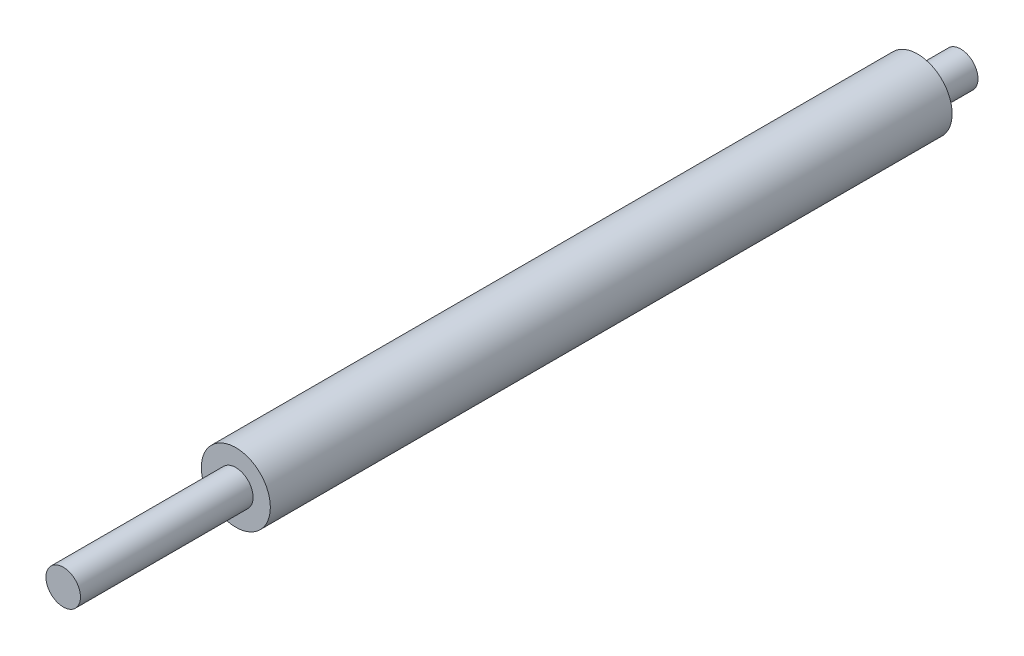
ISO-10303-21;
HEADER;
FILE_DESCRIPTION(('STEP AP214'),'2;1');
FILE_NAME('part.step','',(''),(''),'','','');
FILE_SCHEMA(('AUTOMOTIVE_DESIGN { 1 0 10303 214 1 1 1 1 }'));
ENDSEC;
DATA;
#1=APPLICATION_CONTEXT('core data for automotive mechanical design processes');
#2=APPLICATION_PROTOCOL_DEFINITION('international standard','automotive_design',2000,#1);
#3=PRODUCT_CONTEXT('',#1,'mechanical');
#4=PRODUCT('Part','Part','',(#3));
#5=PRODUCT_RELATED_PRODUCT_CATEGORY('part','',(#4));
#6=PRODUCT_DEFINITION_FORMATION('','',#4);
#7=PRODUCT_DEFINITION_CONTEXT('part definition',#1,'design');
#8=PRODUCT_DEFINITION('design','',#6,#7);
#9=PRODUCT_DEFINITION_SHAPE('','',#8);
#10=(LENGTH_UNIT() NAMED_UNIT(*) SI_UNIT(.MILLI.,.METRE.));
#11=(NAMED_UNIT(*) PLANE_ANGLE_UNIT() SI_UNIT($,.RADIAN.));
#12=(NAMED_UNIT(*) SI_UNIT($,.STERADIAN.) SOLID_ANGLE_UNIT());
#13=UNCERTAINTY_MEASURE_WITH_UNIT(LENGTH_MEASURE(1.E-05),#10,'distance_accuracy_value','');
#14=(GEOMETRIC_REPRESENTATION_CONTEXT(3) GLOBAL_UNCERTAINTY_ASSIGNED_CONTEXT((#13)) GLOBAL_UNIT_ASSIGNED_CONTEXT((#10,
#11,#12)) REPRESENTATION_CONTEXT('',''));
#15=CARTESIAN_POINT('',(0.,0.,0.));
#16=DIRECTION('',(0.,0.,1.));
#17=DIRECTION('',(1.,0.,0.));
#18=AXIS2_PLACEMENT_3D('',#15,#16,#17);
#19=CARTESIAN_POINT('',(0.,0.,59.25));
#20=DIRECTION('',(0.,0.,1.));
#21=DIRECTION('',(1.,0.,0.));
#22=AXIS2_PLACEMENT_3D('',#19,#20,#21);
#23=PLANE('',#22);
#24=CARTESIAN_POINT('',(0.,0.,59.25));
#25=DIRECTION('',(0.,0.,1.));
#26=DIRECTION('',(1.,0.,0.));
#27=AXIS2_PLACEMENT_3D('',#24,#25,#26);
#28=CIRCLE('',#27,6.);
#29=CARTESIAN_POINT('',(6.,0.,59.25));
#30=VERTEX_POINT('',#29);
#31=EDGE_CURVE('E38',#30,#30,#28,.T.);
#32=ORIENTED_EDGE('',*,*,#31,.T.);
#33=EDGE_LOOP('',(#32));
#34=FACE_BOUND('',#33,.T.);
#35=CARTESIAN_POINT('',(0.,0.,59.25));
#36=DIRECTION('',(0.,0.,1.));
#37=DIRECTION('',(1.,0.,0.));
#38=AXIS2_PLACEMENT_3D('',#35,#36,#37);
#39=CIRCLE('',#38,3.);
#40=CARTESIAN_POINT('',(3.,0.,59.25));
#41=VERTEX_POINT('',#40);
#42=EDGE_CURVE('E52',#41,#41,#39,.T.);
#43=ORIENTED_EDGE('',*,*,#42,.F.);
#44=EDGE_LOOP('',(#43));
#45=FACE_BOUND('',#44,.T.);
#46=ADVANCED_FACE('F31',(#34,#45),#23,.T.);
#47=CARTESIAN_POINT('',(0.,0.,-59.25));
#48=DIRECTION('',(0.,0.,1.));
#49=DIRECTION('',(1.,0.,0.));
#50=AXIS2_PLACEMENT_3D('',#47,#48,#49);
#51=PLANE('',#50);
#52=CARTESIAN_POINT('',(0.,0.,-59.25));
#53=DIRECTION('',(0.,0.,1.));
#54=DIRECTION('',(1.,0.,0.));
#55=AXIS2_PLACEMENT_3D('',#52,#53,#54);
#56=CIRCLE('',#55,6.);
#57=CARTESIAN_POINT('',(6.,0.,-59.25));
#58=VERTEX_POINT('',#57);
#59=EDGE_CURVE('E42',#58,#58,#56,.T.);
#60=ORIENTED_EDGE('',*,*,#59,.F.);
#61=EDGE_LOOP('',(#60));
#62=FACE_BOUND('',#61,.T.);
#63=CARTESIAN_POINT('',(0.,0.,-59.25));
#64=DIRECTION('',(0.,0.,1.));
#65=DIRECTION('',(1.,0.,0.));
#66=AXIS2_PLACEMENT_3D('',#63,#64,#65);
#67=CIRCLE('',#66,3.);
#68=CARTESIAN_POINT('',(3.,0.,-59.25));
#69=VERTEX_POINT('',#68);
#70=EDGE_CURVE('E10',#69,#69,#67,.F.);
#71=ORIENTED_EDGE('',*,*,#70,.F.);
#72=EDGE_LOOP('',(#71));
#73=FACE_BOUND('',#72,.T.);
#74=ADVANCED_FACE('F68',(#62,#73),#51,.F.);
#75=CARTESIAN_POINT('',(0.,0.,59.25));
#76=DIRECTION('',(0.,0.,-1.));
#77=DIRECTION('',(-1.,0.,0.));
#78=AXIS2_PLACEMENT_3D('',#75,#76,#77);
#79=CYLINDRICAL_SURFACE('',#78,6.);
#80=ORIENTED_EDGE('',*,*,#31,.F.);
#81=EDGE_LOOP('',(#80));
#82=FACE_BOUND('',#81,.T.);
#83=ORIENTED_EDGE('',*,*,#59,.T.);
#84=EDGE_LOOP('',(#83));
#85=FACE_BOUND('',#84,.T.);
#86=ADVANCED_FACE('F33',(#82,#85),#79,.T.);
#87=CARTESIAN_POINT('',(0.,0.,-66.75));
#88=DIRECTION('',(0.,0.,1.));
#89=DIRECTION('',(1.,0.,0.));
#90=AXIS2_PLACEMENT_3D('',#87,#88,#89);
#91=CYLINDRICAL_SURFACE('',#90,3.);
#92=CARTESIAN_POINT('',(0.,0.,-66.75));
#93=DIRECTION('',(0.,0.,-1.));
#94=DIRECTION('',(-1.,0.,0.));
#95=AXIS2_PLACEMENT_3D('',#92,#93,#94);
#96=CIRCLE('',#95,3.);
#97=CARTESIAN_POINT('',(-3.,0.,-66.75));
#98=VERTEX_POINT('',#97);
#99=EDGE_CURVE('E47',#98,#98,#96,.T.);
#100=ORIENTED_EDGE('',*,*,#99,.F.);
#101=EDGE_LOOP('',(#100));
#102=FACE_BOUND('',#101,.T.);
#103=ORIENTED_EDGE('',*,*,#70,.T.);
#104=EDGE_LOOP('',(#103));
#105=FACE_BOUND('',#104,.T.);
#106=ADVANCED_FACE('F75',(#102,#105),#91,.T.);
#107=CARTESIAN_POINT('',(0.,0.,-66.75));
#108=DIRECTION('',(0.,0.,-1.));
#109=DIRECTION('',(-1.,0.,0.));
#110=AXIS2_PLACEMENT_3D('',#107,#108,#109);
#111=PLANE('',#110);
#112=ORIENTED_EDGE('',*,*,#99,.T.);
#113=EDGE_LOOP('',(#112));
#114=FACE_BOUND('',#113,.T.);
#115=ADVANCED_FACE('F63',(#114),#111,.T.);
#116=CARTESIAN_POINT('',(0.,0.,89.25));
#117=DIRECTION('',(0.,0.,-1.));
#118=DIRECTION('',(-1.,0.,0.));
#119=AXIS2_PLACEMENT_3D('',#116,#117,#118);
#120=CYLINDRICAL_SURFACE('',#119,3.);
#121=CARTESIAN_POINT('',(0.,0.,89.25));
#122=DIRECTION('',(0.,0.,1.));
#123=DIRECTION('',(1.,0.,0.));
#124=AXIS2_PLACEMENT_3D('',#121,#122,#123);
#125=CIRCLE('',#124,3.);
#126=CARTESIAN_POINT('',(3.,0.,89.25));
#127=VERTEX_POINT('',#126);
#128=EDGE_CURVE('E51',#127,#127,#125,.T.);
#129=ORIENTED_EDGE('',*,*,#128,.F.);
#130=EDGE_LOOP('',(#129));
#131=FACE_BOUND('',#130,.T.);
#132=ORIENTED_EDGE('',*,*,#42,.T.);
#133=EDGE_LOOP('',(#132));
#134=FACE_BOUND('',#133,.T.);
#135=ADVANCED_FACE('F60',(#131,#134),#120,.T.);
#136=CARTESIAN_POINT('',(0.,0.,89.25));
#137=DIRECTION('',(0.,0.,1.));
#138=DIRECTION('',(1.,0.,0.));
#139=AXIS2_PLACEMENT_3D('',#136,#137,#138);
#140=PLANE('',#139);
#141=ORIENTED_EDGE('',*,*,#128,.T.);
#142=EDGE_LOOP('',(#141));
#143=FACE_BOUND('',#142,.T.);
#144=ADVANCED_FACE('F58',(#143),#140,.T.);
#145=CLOSED_SHELL('',(#46,#74,#86,#106,#115,#135,#144));
#146=MANIFOLD_SOLID_BREP('B2',#145);
#147=ADVANCED_BREP_SHAPE_REPRESENTATION('',(#18,#146),#14);
#148=SHAPE_DEFINITION_REPRESENTATION(#9,#147);
ENDSEC;
END-ISO-10303-21;
